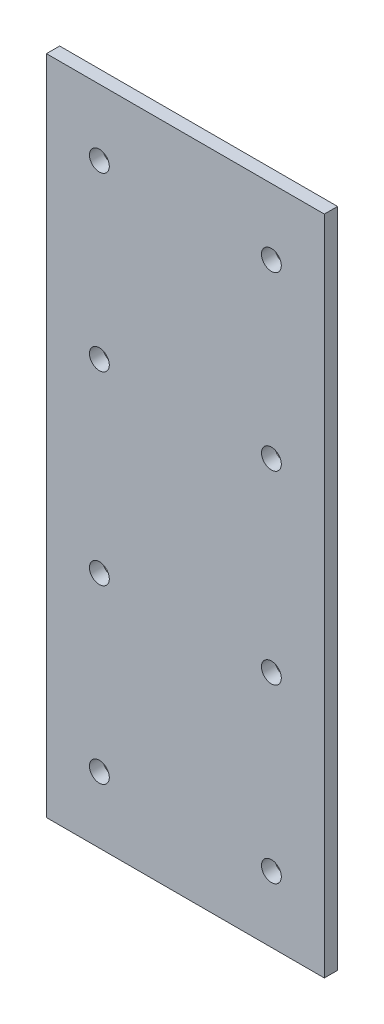
ISO-10303-21;
HEADER;
FILE_DESCRIPTION(('STEP AP214'),'2;1');
FILE_NAME('part.step','',(''),(''),'','','');
FILE_SCHEMA(('AUTOMOTIVE_DESIGN { 1 0 10303 214 1 1 1 1 }'));
ENDSEC;
DATA;
#1=APPLICATION_CONTEXT('core data for automotive mechanical design processes');
#2=APPLICATION_PROTOCOL_DEFINITION('international standard','automotive_design',2000,#1);
#3=PRODUCT_CONTEXT('',#1,'mechanical');
#4=PRODUCT('Part','Part','',(#3));
#5=PRODUCT_RELATED_PRODUCT_CATEGORY('part','',(#4));
#6=PRODUCT_DEFINITION_FORMATION('','',#4);
#7=PRODUCT_DEFINITION_CONTEXT('part definition',#1,'design');
#8=PRODUCT_DEFINITION('design','',#6,#7);
#9=PRODUCT_DEFINITION_SHAPE('','',#8);
#10=(LENGTH_UNIT() NAMED_UNIT(*) SI_UNIT(.MILLI.,.METRE.));
#11=(NAMED_UNIT(*) PLANE_ANGLE_UNIT() SI_UNIT($,.RADIAN.));
#12=(NAMED_UNIT(*) SI_UNIT($,.STERADIAN.) SOLID_ANGLE_UNIT());
#13=UNCERTAINTY_MEASURE_WITH_UNIT(LENGTH_MEASURE(1.E-05),#10,'distance_accuracy_value','');
#14=(GEOMETRIC_REPRESENTATION_CONTEXT(3) GLOBAL_UNCERTAINTY_ASSIGNED_CONTEXT((#13)) GLOBAL_UNIT_ASSIGNED_CONTEXT((#10,
#11,#12)) REPRESENTATION_CONTEXT('',''));
#15=CARTESIAN_POINT('',(0.,0.,0.));
#16=DIRECTION('',(0.,0.,1.));
#17=DIRECTION('',(1.,0.,0.));
#18=AXIS2_PLACEMENT_3D('',#15,#16,#17);
#19=CARTESIAN_POINT('',(-21.,-50.,2.));
#20=DIRECTION('',(1.,0.,0.));
#21=DIRECTION('',(0.,0.,-1.));
#22=AXIS2_PLACEMENT_3D('',#19,#20,#21);
#23=PLANE('',#22);
#24=DIRECTION('',(0.,-1.,0.));
#25=VECTOR('',#24,1.);
#26=CARTESIAN_POINT('',(-21.,-50.,0.));
#27=LINE('',#26,#25);
#28=CARTESIAN_POINT('',(-21.,50.,0.));
#29=VERTEX_POINT('',#28);
#30=CARTESIAN_POINT('',(-21.,-50.,0.));
#31=VERTEX_POINT('',#30);
#32=EDGE_CURVE('E96',#29,#31,#27,.T.);
#33=ORIENTED_EDGE('',*,*,#32,.T.);
#34=DIRECTION('',(0.,0.,-1.));
#35=VECTOR('',#34,1.);
#36=CARTESIAN_POINT('',(-21.,-50.,2.));
#37=LINE('',#36,#35);
#38=CARTESIAN_POINT('',(-21.,-50.,2.));
#39=VERTEX_POINT('',#38);
#40=EDGE_CURVE('E11',#39,#31,#37,.T.);
#41=ORIENTED_EDGE('',*,*,#40,.F.);
#42=DIRECTION('',(0.,-1.,0.));
#43=VECTOR('',#42,1.);
#44=CARTESIAN_POINT('',(-21.,-50.,2.));
#45=LINE('',#44,#43);
#46=CARTESIAN_POINT('',(-21.,50.,2.));
#47=VERTEX_POINT('',#46);
#48=EDGE_CURVE('E84',#47,#39,#45,.T.);
#49=ORIENTED_EDGE('',*,*,#48,.F.);
#50=DIRECTION('',(0.,0.,-1.));
#51=VECTOR('',#50,1.);
#52=CARTESIAN_POINT('',(-21.,50.,2.));
#53=LINE('',#52,#51);
#54=EDGE_CURVE('E92',#47,#29,#53,.T.);
#55=ORIENTED_EDGE('',*,*,#54,.T.);
#56=EDGE_LOOP('',(#33,#41,#49,#55));
#57=FACE_BOUND('',#56,.T.);
#58=ADVANCED_FACE('F33',(#57),#23,.F.);
#59=CARTESIAN_POINT('',(21.,-50.,2.));
#60=DIRECTION('',(0.,1.,0.));
#61=DIRECTION('',(-1.,0.,0.));
#62=AXIS2_PLACEMENT_3D('',#59,#60,#61);
#63=PLANE('',#62);
#64=DIRECTION('',(1.,0.,0.));
#65=VECTOR('',#64,1.);
#66=CARTESIAN_POINT('',(21.,-50.,0.));
#67=LINE('',#66,#65);
#68=CARTESIAN_POINT('',(21.,-50.,0.));
#69=VERTEX_POINT('',#68);
#70=EDGE_CURVE('E88',#31,#69,#67,.T.);
#71=ORIENTED_EDGE('',*,*,#70,.T.);
#72=DIRECTION('',(0.,0.,-1.));
#73=VECTOR('',#72,1.);
#74=CARTESIAN_POINT('',(21.,-50.,2.));
#75=LINE('',#74,#73);
#76=CARTESIAN_POINT('',(21.,-50.,2.));
#77=VERTEX_POINT('',#76);
#78=EDGE_CURVE('E41',#77,#69,#75,.T.);
#79=ORIENTED_EDGE('',*,*,#78,.F.);
#80=DIRECTION('',(1.,0.,0.));
#81=VECTOR('',#80,1.);
#82=CARTESIAN_POINT('',(21.,-50.,2.));
#83=LINE('',#82,#81);
#84=EDGE_CURVE('E79',#39,#77,#83,.T.);
#85=ORIENTED_EDGE('',*,*,#84,.F.);
#86=ORIENTED_EDGE('',*,*,#40,.T.);
#87=EDGE_LOOP('',(#71,#79,#85,#86));
#88=FACE_BOUND('',#87,.T.);
#89=ADVANCED_FACE('F87',(#88),#63,.F.);
#90=CARTESIAN_POINT('',(21.,-50.,2.));
#91=DIRECTION('',(-1.,0.,0.));
#92=DIRECTION('',(0.,0.,1.));
#93=AXIS2_PLACEMENT_3D('',#90,#91,#92);
#94=PLANE('',#93);
#95=DIRECTION('',(0.,1.,0.));
#96=VECTOR('',#95,1.);
#97=CARTESIAN_POINT('',(21.,-50.,0.));
#98=LINE('',#97,#96);
#99=CARTESIAN_POINT('',(21.,50.,0.));
#100=VERTEX_POINT('',#99);
#101=EDGE_CURVE('E66',#69,#100,#98,.T.);
#102=ORIENTED_EDGE('',*,*,#101,.T.);
#103=DIRECTION('',(0.,0.,-1.));
#104=VECTOR('',#103,1.);
#105=CARTESIAN_POINT('',(21.,50.,2.));
#106=LINE('',#105,#104);
#107=CARTESIAN_POINT('',(21.,50.,2.));
#108=VERTEX_POINT('',#107);
#109=EDGE_CURVE('E89',#108,#100,#106,.T.);
#110=ORIENTED_EDGE('',*,*,#109,.F.);
#111=DIRECTION('',(0.,1.,0.));
#112=VECTOR('',#111,1.);
#113=CARTESIAN_POINT('',(21.,-50.,2.));
#114=LINE('',#113,#112);
#115=EDGE_CURVE('E82',#77,#108,#114,.T.);
#116=ORIENTED_EDGE('',*,*,#115,.F.);
#117=ORIENTED_EDGE('',*,*,#78,.T.);
#118=EDGE_LOOP('',(#102,#110,#116,#117));
#119=FACE_BOUND('',#118,.T.);
#120=ADVANCED_FACE('F90',(#119),#94,.F.);
#121=CARTESIAN_POINT('',(21.,50.,2.));
#122=DIRECTION('',(0.,-1.,0.));
#123=DIRECTION('',(0.,0.,-1.));
#124=AXIS2_PLACEMENT_3D('',#121,#122,#123);
#125=PLANE('',#124);
#126=DIRECTION('',(-1.,0.,0.));
#127=VECTOR('',#126,1.);
#128=CARTESIAN_POINT('',(21.,50.,0.));
#129=LINE('',#128,#127);
#130=EDGE_CURVE('E72',#100,#29,#129,.T.);
#131=ORIENTED_EDGE('',*,*,#130,.T.);
#132=ORIENTED_EDGE('',*,*,#54,.F.);
#133=DIRECTION('',(-1.,0.,0.));
#134=VECTOR('',#133,1.);
#135=CARTESIAN_POINT('',(21.,50.,2.));
#136=LINE('',#135,#134);
#137=EDGE_CURVE('E49',#108,#47,#136,.T.);
#138=ORIENTED_EDGE('',*,*,#137,.F.);
#139=ORIENTED_EDGE('',*,*,#109,.T.);
#140=EDGE_LOOP('',(#131,#132,#138,#139));
#141=FACE_BOUND('',#140,.T.);
#142=ADVANCED_FACE('F104',(#141),#125,.F.);
#143=CARTESIAN_POINT('',(0.,0.,2.));
#144=DIRECTION('',(0.,0.,1.));
#145=DIRECTION('',(1.,0.,0.));
#146=AXIS2_PLACEMENT_3D('',#143,#144,#145);
#147=PLANE('',#146);
#148=CARTESIAN_POINT('',(-13.,14.,2.));
#149=DIRECTION('',(0.,0.,1.));
#150=DIRECTION('',(1.,0.,0.));
#151=AXIS2_PLACEMENT_3D('',#148,#149,#150);
#152=CIRCLE('',#151,1.5);
#153=CARTESIAN_POINT('',(-11.5,14.,2.));
#154=VERTEX_POINT('',#153);
#155=EDGE_CURVE('E152',#154,#154,#152,.T.);
#156=ORIENTED_EDGE('',*,*,#155,.F.);
#157=EDGE_LOOP('',(#156));
#158=FACE_BOUND('',#157,.T.);
#159=CARTESIAN_POINT('',(13.,14.,2.));
#160=DIRECTION('',(0.,0.,1.));
#161=DIRECTION('',(1.,0.,0.));
#162=AXIS2_PLACEMENT_3D('',#159,#160,#161);
#163=CIRCLE('',#162,1.5);
#164=CARTESIAN_POINT('',(14.5,14.,2.));
#165=VERTEX_POINT('',#164);
#166=EDGE_CURVE('E146',#165,#165,#163,.T.);
#167=ORIENTED_EDGE('',*,*,#166,.F.);
#168=EDGE_LOOP('',(#167));
#169=FACE_BOUND('',#168,.T.);
#170=CARTESIAN_POINT('',(-13.,40.,2.));
#171=DIRECTION('',(0.,0.,1.));
#172=DIRECTION('',(-1.,0.,0.));
#173=AXIS2_PLACEMENT_3D('',#170,#171,#172);
#174=CIRCLE('',#173,1.5);
#175=CARTESIAN_POINT('',(-14.5,40.,2.));
#176=VERTEX_POINT('',#175);
#177=EDGE_CURVE('E140',#176,#176,#174,.T.);
#178=ORIENTED_EDGE('',*,*,#177,.F.);
#179=EDGE_LOOP('',(#178));
#180=FACE_BOUND('',#179,.T.);
#181=CARTESIAN_POINT('',(13.,40.,2.));
#182=DIRECTION('',(0.,0.,1.));
#183=DIRECTION('',(-1.,0.,0.));
#184=AXIS2_PLACEMENT_3D('',#181,#182,#183);
#185=CIRCLE('',#184,1.5);
#186=CARTESIAN_POINT('',(11.5,40.,2.));
#187=VERTEX_POINT('',#186);
#188=EDGE_CURVE('E134',#187,#187,#185,.T.);
#189=ORIENTED_EDGE('',*,*,#188,.F.);
#190=EDGE_LOOP('',(#189));
#191=FACE_BOUND('',#190,.T.);
#192=CARTESIAN_POINT('',(-13.,-14.,2.));
#193=DIRECTION('',(0.,0.,1.));
#194=DIRECTION('',(-1.,0.,0.));
#195=AXIS2_PLACEMENT_3D('',#192,#193,#194);
#196=CIRCLE('',#195,1.5);
#197=CARTESIAN_POINT('',(-14.5,-14.,2.));
#198=VERTEX_POINT('',#197);
#199=EDGE_CURVE('E128',#198,#198,#196,.T.);
#200=ORIENTED_EDGE('',*,*,#199,.F.);
#201=EDGE_LOOP('',(#200));
#202=FACE_BOUND('',#201,.T.);
#203=CARTESIAN_POINT('',(13.,-14.,2.));
#204=DIRECTION('',(0.,0.,1.));
#205=DIRECTION('',(-1.,0.,0.));
#206=AXIS2_PLACEMENT_3D('',#203,#204,#205);
#207=CIRCLE('',#206,1.5);
#208=CARTESIAN_POINT('',(11.5,-14.,2.));
#209=VERTEX_POINT('',#208);
#210=EDGE_CURVE('E122',#209,#209,#207,.T.);
#211=ORIENTED_EDGE('',*,*,#210,.F.);
#212=EDGE_LOOP('',(#211));
#213=FACE_BOUND('',#212,.T.);
#214=CARTESIAN_POINT('',(13.,-40.,2.));
#215=DIRECTION('',(0.,0.,1.));
#216=DIRECTION('',(1.,0.,0.));
#217=AXIS2_PLACEMENT_3D('',#214,#215,#216);
#218=CIRCLE('',#217,1.5);
#219=CARTESIAN_POINT('',(14.5,-40.,2.));
#220=VERTEX_POINT('',#219);
#221=EDGE_CURVE('E116',#220,#220,#218,.T.);
#222=ORIENTED_EDGE('',*,*,#221,.F.);
#223=EDGE_LOOP('',(#222));
#224=FACE_BOUND('',#223,.T.);
#225=CARTESIAN_POINT('',(-13.,-40.,2.));
#226=DIRECTION('',(0.,0.,1.));
#227=DIRECTION('',(1.,0.,0.));
#228=AXIS2_PLACEMENT_3D('',#225,#226,#227);
#229=CIRCLE('',#228,1.5);
#230=CARTESIAN_POINT('',(-11.5,-40.,2.));
#231=VERTEX_POINT('',#230);
#232=EDGE_CURVE('E110',#231,#231,#229,.T.);
#233=ORIENTED_EDGE('',*,*,#232,.F.);
#234=EDGE_LOOP('',(#233));
#235=FACE_BOUND('',#234,.T.);
#236=ORIENTED_EDGE('',*,*,#48,.T.);
#237=ORIENTED_EDGE('',*,*,#84,.T.);
#238=ORIENTED_EDGE('',*,*,#115,.T.);
#239=ORIENTED_EDGE('',*,*,#137,.T.);
#240=EDGE_LOOP('',(#236,#237,#238,#239));
#241=FACE_BOUND('',#240,.T.);
#242=ADVANCED_FACE('F80',(#158,#169,#180,#191,#202,#213,#224,#235,#241),#147,.T.);
#243=CARTESIAN_POINT('',(0.,0.,0.));
#244=DIRECTION('',(0.,0.,1.));
#245=DIRECTION('',(1.,0.,0.));
#246=AXIS2_PLACEMENT_3D('',#243,#244,#245);
#247=PLANE('',#246);
#248=CARTESIAN_POINT('',(-13.,14.,0.));
#249=DIRECTION('',(0.,0.,1.));
#250=DIRECTION('',(1.,0.,0.));
#251=AXIS2_PLACEMENT_3D('',#248,#249,#250);
#252=CIRCLE('',#251,1.5);
#253=CARTESIAN_POINT('',(-11.5,14.,0.));
#254=VERTEX_POINT('',#253);
#255=EDGE_CURVE('E149',#254,#254,#252,.T.);
#256=ORIENTED_EDGE('',*,*,#255,.T.);
#257=EDGE_LOOP('',(#256));
#258=FACE_BOUND('',#257,.T.);
#259=CARTESIAN_POINT('',(13.,14.,0.));
#260=DIRECTION('',(0.,0.,1.));
#261=DIRECTION('',(1.,0.,0.));
#262=AXIS2_PLACEMENT_3D('',#259,#260,#261);
#263=CIRCLE('',#262,1.5);
#264=CARTESIAN_POINT('',(14.5,14.,0.));
#265=VERTEX_POINT('',#264);
#266=EDGE_CURVE('E143',#265,#265,#263,.T.);
#267=ORIENTED_EDGE('',*,*,#266,.T.);
#268=EDGE_LOOP('',(#267));
#269=FACE_BOUND('',#268,.T.);
#270=CARTESIAN_POINT('',(-13.,40.,0.));
#271=DIRECTION('',(0.,0.,1.));
#272=DIRECTION('',(-1.,0.,0.));
#273=AXIS2_PLACEMENT_3D('',#270,#271,#272);
#274=CIRCLE('',#273,1.5);
#275=CARTESIAN_POINT('',(-14.5,40.,0.));
#276=VERTEX_POINT('',#275);
#277=EDGE_CURVE('E137',#276,#276,#274,.T.);
#278=ORIENTED_EDGE('',*,*,#277,.T.);
#279=EDGE_LOOP('',(#278));
#280=FACE_BOUND('',#279,.T.);
#281=CARTESIAN_POINT('',(13.,40.,0.));
#282=DIRECTION('',(0.,0.,1.));
#283=DIRECTION('',(-1.,0.,0.));
#284=AXIS2_PLACEMENT_3D('',#281,#282,#283);
#285=CIRCLE('',#284,1.5);
#286=CARTESIAN_POINT('',(11.5,40.,0.));
#287=VERTEX_POINT('',#286);
#288=EDGE_CURVE('E131',#287,#287,#285,.T.);
#289=ORIENTED_EDGE('',*,*,#288,.T.);
#290=EDGE_LOOP('',(#289));
#291=FACE_BOUND('',#290,.T.);
#292=CARTESIAN_POINT('',(-13.,-14.,0.));
#293=DIRECTION('',(0.,0.,1.));
#294=DIRECTION('',(-1.,0.,0.));
#295=AXIS2_PLACEMENT_3D('',#292,#293,#294);
#296=CIRCLE('',#295,1.5);
#297=CARTESIAN_POINT('',(-14.5,-14.,0.));
#298=VERTEX_POINT('',#297);
#299=EDGE_CURVE('E125',#298,#298,#296,.T.);
#300=ORIENTED_EDGE('',*,*,#299,.T.);
#301=EDGE_LOOP('',(#300));
#302=FACE_BOUND('',#301,.T.);
#303=CARTESIAN_POINT('',(13.,-14.,0.));
#304=DIRECTION('',(0.,0.,1.));
#305=DIRECTION('',(-1.,0.,0.));
#306=AXIS2_PLACEMENT_3D('',#303,#304,#305);
#307=CIRCLE('',#306,1.5);
#308=CARTESIAN_POINT('',(11.5,-14.,0.));
#309=VERTEX_POINT('',#308);
#310=EDGE_CURVE('E119',#309,#309,#307,.T.);
#311=ORIENTED_EDGE('',*,*,#310,.T.);
#312=EDGE_LOOP('',(#311));
#313=FACE_BOUND('',#312,.T.);
#314=CARTESIAN_POINT('',(13.,-40.,0.));
#315=DIRECTION('',(0.,0.,1.));
#316=DIRECTION('',(1.,0.,0.));
#317=AXIS2_PLACEMENT_3D('',#314,#315,#316);
#318=CIRCLE('',#317,1.5);
#319=CARTESIAN_POINT('',(14.5,-40.,0.));
#320=VERTEX_POINT('',#319);
#321=EDGE_CURVE('E113',#320,#320,#318,.T.);
#322=ORIENTED_EDGE('',*,*,#321,.T.);
#323=EDGE_LOOP('',(#322));
#324=FACE_BOUND('',#323,.T.);
#325=CARTESIAN_POINT('',(-13.,-40.,0.));
#326=DIRECTION('',(0.,0.,1.));
#327=DIRECTION('',(1.,0.,0.));
#328=AXIS2_PLACEMENT_3D('',#325,#326,#327);
#329=CIRCLE('',#328,1.5);
#330=CARTESIAN_POINT('',(-11.5,-40.,0.));
#331=VERTEX_POINT('',#330);
#332=EDGE_CURVE('E99',#331,#331,#329,.T.);
#333=ORIENTED_EDGE('',*,*,#332,.T.);
#334=EDGE_LOOP('',(#333));
#335=FACE_BOUND('',#334,.T.);
#336=ORIENTED_EDGE('',*,*,#32,.F.);
#337=ORIENTED_EDGE('',*,*,#130,.F.);
#338=ORIENTED_EDGE('',*,*,#101,.F.);
#339=ORIENTED_EDGE('',*,*,#70,.F.);
#340=EDGE_LOOP('',(#336,#337,#338,#339));
#341=FACE_BOUND('',#340,.T.);
#342=ADVANCED_FACE('F107',(#258,#269,#280,#291,#302,#313,#324,#335,#341),#247,.F.);
#343=CARTESIAN_POINT('',(-13.,-40.,0.));
#344=DIRECTION('',(0.,0.,1.));
#345=DIRECTION('',(1.,0.,0.));
#346=AXIS2_PLACEMENT_3D('',#343,#344,#345);
#347=CYLINDRICAL_SURFACE('',#346,1.5);
#348=ORIENTED_EDGE('',*,*,#332,.F.);
#349=EDGE_LOOP('',(#348));
#350=FACE_BOUND('',#349,.T.);
#351=ORIENTED_EDGE('',*,*,#232,.T.);
#352=EDGE_LOOP('',(#351));
#353=FACE_BOUND('',#352,.T.);
#354=ADVANCED_FACE('F184',(#350,#353),#347,.F.);
#355=CARTESIAN_POINT('',(13.,-40.,0.));
#356=DIRECTION('',(0.,0.,1.));
#357=DIRECTION('',(1.,0.,0.));
#358=AXIS2_PLACEMENT_3D('',#355,#356,#357);
#359=CYLINDRICAL_SURFACE('',#358,1.5);
#360=ORIENTED_EDGE('',*,*,#321,.F.);
#361=EDGE_LOOP('',(#360));
#362=FACE_BOUND('',#361,.T.);
#363=ORIENTED_EDGE('',*,*,#221,.T.);
#364=EDGE_LOOP('',(#363));
#365=FACE_BOUND('',#364,.T.);
#366=ADVANCED_FACE('F186',(#362,#365),#359,.F.);
#367=CARTESIAN_POINT('',(13.,-14.,0.));
#368=DIRECTION('',(0.,0.,1.));
#369=DIRECTION('',(1.,0.,0.));
#370=AXIS2_PLACEMENT_3D('',#367,#368,#369);
#371=CYLINDRICAL_SURFACE('',#370,1.5);
#372=ORIENTED_EDGE('',*,*,#310,.F.);
#373=EDGE_LOOP('',(#372));
#374=FACE_BOUND('',#373,.T.);
#375=ORIENTED_EDGE('',*,*,#210,.T.);
#376=EDGE_LOOP('',(#375));
#377=FACE_BOUND('',#376,.T.);
#378=ADVANCED_FACE('F193',(#374,#377),#371,.F.);
#379=CARTESIAN_POINT('',(-13.,-14.,0.));
#380=DIRECTION('',(0.,0.,1.));
#381=DIRECTION('',(1.,0.,0.));
#382=AXIS2_PLACEMENT_3D('',#379,#380,#381);
#383=CYLINDRICAL_SURFACE('',#382,1.5);
#384=ORIENTED_EDGE('',*,*,#299,.F.);
#385=EDGE_LOOP('',(#384));
#386=FACE_BOUND('',#385,.T.);
#387=ORIENTED_EDGE('',*,*,#199,.T.);
#388=EDGE_LOOP('',(#387));
#389=FACE_BOUND('',#388,.T.);
#390=ADVANCED_FACE('F239',(#386,#389),#383,.F.);
#391=CARTESIAN_POINT('',(13.,40.,0.));
#392=DIRECTION('',(0.,0.,1.));
#393=DIRECTION('',(1.,0.,0.));
#394=AXIS2_PLACEMENT_3D('',#391,#392,#393);
#395=CYLINDRICAL_SURFACE('',#394,1.5);
#396=ORIENTED_EDGE('',*,*,#288,.F.);
#397=EDGE_LOOP('',(#396));
#398=FACE_BOUND('',#397,.T.);
#399=ORIENTED_EDGE('',*,*,#188,.T.);
#400=EDGE_LOOP('',(#399));
#401=FACE_BOUND('',#400,.T.);
#402=ADVANCED_FACE('F249',(#398,#401),#395,.F.);
#403=CARTESIAN_POINT('',(-13.,40.,0.));
#404=DIRECTION('',(0.,0.,1.));
#405=DIRECTION('',(1.,0.,0.));
#406=AXIS2_PLACEMENT_3D('',#403,#404,#405);
#407=CYLINDRICAL_SURFACE('',#406,1.5);
#408=ORIENTED_EDGE('',*,*,#277,.F.);
#409=EDGE_LOOP('',(#408));
#410=FACE_BOUND('',#409,.T.);
#411=ORIENTED_EDGE('',*,*,#177,.T.);
#412=EDGE_LOOP('',(#411));
#413=FACE_BOUND('',#412,.T.);
#414=ADVANCED_FACE('F259',(#410,#413),#407,.F.);
#415=CARTESIAN_POINT('',(13.,14.,0.));
#416=DIRECTION('',(0.,0.,1.));
#417=DIRECTION('',(1.,0.,0.));
#418=AXIS2_PLACEMENT_3D('',#415,#416,#417);
#419=CYLINDRICAL_SURFACE('',#418,1.5);
#420=ORIENTED_EDGE('',*,*,#266,.F.);
#421=EDGE_LOOP('',(#420));
#422=FACE_BOUND('',#421,.T.);
#423=ORIENTED_EDGE('',*,*,#166,.T.);
#424=EDGE_LOOP('',(#423));
#425=FACE_BOUND('',#424,.T.);
#426=ADVANCED_FACE('F163',(#422,#425),#419,.F.);
#427=CARTESIAN_POINT('',(-13.,14.,0.));
#428=DIRECTION('',(0.,0.,1.));
#429=DIRECTION('',(1.,0.,0.));
#430=AXIS2_PLACEMENT_3D('',#427,#428,#429);
#431=CYLINDRICAL_SURFACE('',#430,1.5);
#432=ORIENTED_EDGE('',*,*,#255,.F.);
#433=EDGE_LOOP('',(#432));
#434=FACE_BOUND('',#433,.T.);
#435=ORIENTED_EDGE('',*,*,#155,.T.);
#436=EDGE_LOOP('',(#435));
#437=FACE_BOUND('',#436,.T.);
#438=ADVANCED_FACE('F160',(#434,#437),#431,.F.);
#439=CLOSED_SHELL('',(#58,#89,#120,#142,#242,#342,#354,#366,#378,#390,#402,#414,#426,#438));
#440=MANIFOLD_SOLID_BREP('B2',#439);
#441=ADVANCED_BREP_SHAPE_REPRESENTATION('',(#18,#440),#14);
#442=SHAPE_DEFINITION_REPRESENTATION(#9,#441);
ENDSEC;
END-ISO-10303-21;
